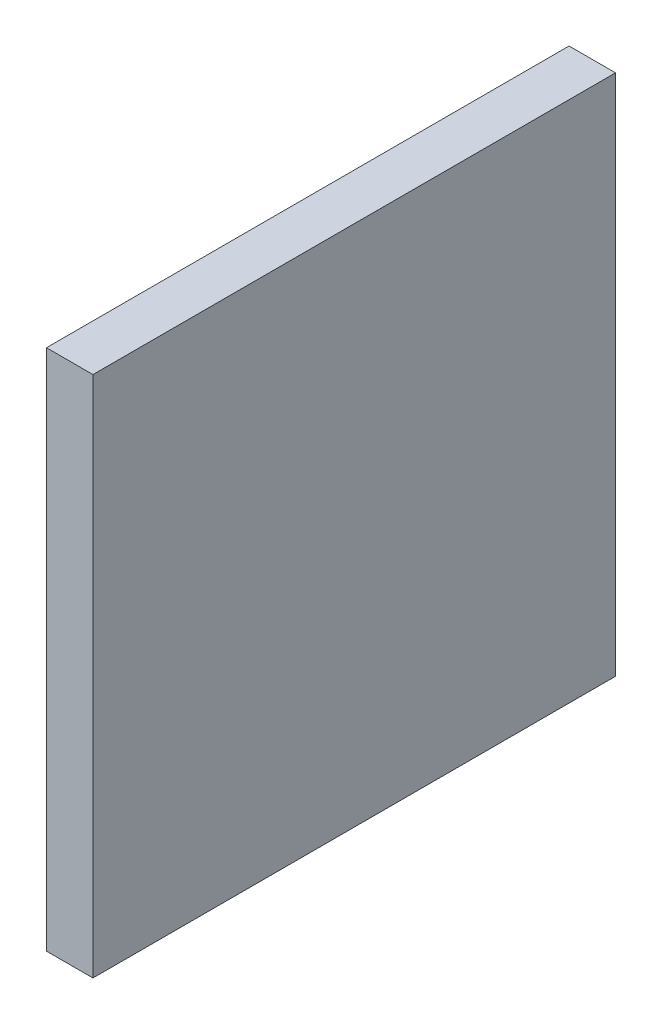
ISO-10303-21;
HEADER;
FILE_DESCRIPTION(('STEP AP214'),'2;1');
FILE_NAME('part.step','',(''),(''),'','','');
FILE_SCHEMA(('AUTOMOTIVE_DESIGN { 1 0 10303 214 1 1 1 1 }'));
ENDSEC;
DATA;
#1=APPLICATION_CONTEXT('core data for automotive mechanical design processes');
#2=APPLICATION_PROTOCOL_DEFINITION('international standard','automotive_design',2000,#1);
#3=PRODUCT_CONTEXT('',#1,'mechanical');
#4=PRODUCT('Part','Part','',(#3));
#5=PRODUCT_RELATED_PRODUCT_CATEGORY('part','',(#4));
#6=PRODUCT_DEFINITION_FORMATION('','',#4);
#7=PRODUCT_DEFINITION_CONTEXT('part definition',#1,'design');
#8=PRODUCT_DEFINITION('design','',#6,#7);
#9=PRODUCT_DEFINITION_SHAPE('','',#8);
#10=(LENGTH_UNIT() NAMED_UNIT(*) SI_UNIT(.MILLI.,.METRE.));
#11=(NAMED_UNIT(*) PLANE_ANGLE_UNIT() SI_UNIT($,.RADIAN.));
#12=(NAMED_UNIT(*) SI_UNIT($,.STERADIAN.) SOLID_ANGLE_UNIT());
#13=UNCERTAINTY_MEASURE_WITH_UNIT(LENGTH_MEASURE(1.E-05),#10,'distance_accuracy_value','');
#14=(GEOMETRIC_REPRESENTATION_CONTEXT(3) GLOBAL_UNCERTAINTY_ASSIGNED_CONTEXT((#13)) GLOBAL_UNIT_ASSIGNED_CONTEXT((#10,
#11,#12)) REPRESENTATION_CONTEXT('',''));
#15=CARTESIAN_POINT('',(0.,0.,0.));
#16=DIRECTION('',(0.,0.,1.));
#17=DIRECTION('',(1.,0.,0.));
#18=AXIS2_PLACEMENT_3D('',#15,#16,#17);
#19=CARTESIAN_POINT('',(-4.98108073090918,-19.7363589291602,0.));
#20=DIRECTION('',(-1.,0.,0.));
#21=DIRECTION('',(0.,-1.,0.));
#22=AXIS2_PLACEMENT_3D('',#19,#20,#21);
#23=PLANE('',#22);
#24=DIRECTION('',(0.,1.,0.));
#25=VECTOR('',#24,1.);
#26=CARTESIAN_POINT('',(-4.98108073090918,15.2636410708398,-28.));
#27=LINE('',#26,#25);
#28=CARTESIAN_POINT('',(-4.98108073090917,-40.7363589291602,-28.));
#29=VERTEX_POINT('',#28);
#30=CARTESIAN_POINT('',(-4.98108073090918,15.2636410708398,-28.));
#31=VERTEX_POINT('',#30);
#32=EDGE_CURVE('E75',#29,#31,#27,.T.);
#33=ORIENTED_EDGE('',*,*,#32,.F.);
#34=DIRECTION('',(0.,0.,-1.));
#35=VECTOR('',#34,1.);
#36=CARTESIAN_POINT('',(-4.98108073090917,-40.7363589291602,28.));
#37=LINE('',#36,#35);
#38=CARTESIAN_POINT('',(-4.98108073090917,-40.7363589291602,28.));
#39=VERTEX_POINT('',#38);
#40=EDGE_CURVE('E83',#39,#29,#37,.T.);
#41=ORIENTED_EDGE('',*,*,#40,.F.);
#42=DIRECTION('',(0.,-1.,0.));
#43=VECTOR('',#42,1.);
#44=CARTESIAN_POINT('',(-4.98108073090918,15.2636410708398,28.));
#45=LINE('',#44,#43);
#46=CARTESIAN_POINT('',(-4.98108073090918,15.2636410708398,28.));
#47=VERTEX_POINT('',#46);
#48=EDGE_CURVE('E49',#47,#39,#45,.T.);
#49=ORIENTED_EDGE('',*,*,#48,.F.);
#50=DIRECTION('',(0.,0.,1.));
#51=VECTOR('',#50,1.);
#52=CARTESIAN_POINT('',(-4.98108073090918,15.2636410708398,28.));
#53=LINE('',#52,#51);
#54=EDGE_CURVE('E73',#31,#47,#53,.T.);
#55=ORIENTED_EDGE('',*,*,#54,.F.);
#56=EDGE_LOOP('',(#33,#41,#49,#55));
#57=FACE_BOUND('',#56,.T.);
#58=ADVANCED_FACE('F33',(#57),#23,.T.);
#59=CARTESIAN_POINT('',(0.,0.,0.));
#60=DIRECTION('',(1.,0.,0.));
#61=DIRECTION('',(0.,0.,-1.));
#62=AXIS2_PLACEMENT_3D('',#59,#60,#61);
#63=PLANE('',#62);
#64=DIRECTION('',(0.,1.,0.));
#65=VECTOR('',#64,1.);
#66=CARTESIAN_POINT('',(0.,15.2636410708398,-28.));
#67=LINE('',#66,#65);
#68=CARTESIAN_POINT('',(0.,-40.7363589291602,-28.));
#69=VERTEX_POINT('',#68);
#70=CARTESIAN_POINT('',(0.,15.2636410708398,-28.));
#71=VERTEX_POINT('',#70);
#72=EDGE_CURVE('E82',#69,#71,#67,.T.);
#73=ORIENTED_EDGE('',*,*,#72,.T.);
#74=DIRECTION('',(0.,0.,1.));
#75=VECTOR('',#74,1.);
#76=CARTESIAN_POINT('',(0.,15.2636410708398,28.));
#77=LINE('',#76,#75);
#78=CARTESIAN_POINT('',(0.,15.2636410708398,28.));
#79=VERTEX_POINT('',#78);
#80=EDGE_CURVE('E87',#71,#79,#77,.T.);
#81=ORIENTED_EDGE('',*,*,#80,.T.);
#82=DIRECTION('',(0.,-1.,0.));
#83=VECTOR('',#82,1.);
#84=CARTESIAN_POINT('',(0.,15.2636410708398,28.));
#85=LINE('',#84,#83);
#86=CARTESIAN_POINT('',(0.,-40.7363589291602,28.));
#87=VERTEX_POINT('',#86);
#88=EDGE_CURVE('E92',#79,#87,#85,.T.);
#89=ORIENTED_EDGE('',*,*,#88,.T.);
#90=DIRECTION('',(0.,0.,-1.));
#91=VECTOR('',#90,1.);
#92=CARTESIAN_POINT('',(0.,-40.7363589291602,28.));
#93=LINE('',#92,#91);
#94=EDGE_CURVE('E90',#87,#69,#93,.T.);
#95=ORIENTED_EDGE('',*,*,#94,.T.);
#96=EDGE_LOOP('',(#73,#81,#89,#95));
#97=FACE_BOUND('',#96,.T.);
#98=ADVANCED_FACE('F103',(#97),#63,.T.);
#99=CARTESIAN_POINT('',(-50.,15.2636410708398,28.));
#100=DIRECTION('',(0.,1.,0.));
#101=DIRECTION('',(0.,0.,1.));
#102=AXIS2_PLACEMENT_3D('',#99,#100,#101);
#103=PLANE('',#102);
#104=DIRECTION('',(1.,0.,0.));
#105=VECTOR('',#104,1.);
#106=CARTESIAN_POINT('',(-50.,15.2636410708398,-28.));
#107=LINE('',#106,#105);
#108=EDGE_CURVE('E36',#31,#71,#107,.T.);
#109=ORIENTED_EDGE('',*,*,#108,.F.);
#110=ORIENTED_EDGE('',*,*,#54,.T.);
#111=DIRECTION('',(1.,0.,0.));
#112=VECTOR('',#111,1.);
#113=CARTESIAN_POINT('',(-50.,15.2636410708398,28.));
#114=LINE('',#113,#112);
#115=EDGE_CURVE('E89',#47,#79,#114,.T.);
#116=ORIENTED_EDGE('',*,*,#115,.T.);
#117=ORIENTED_EDGE('',*,*,#80,.F.);
#118=EDGE_LOOP('',(#109,#110,#116,#117));
#119=FACE_BOUND('',#118,.T.);
#120=ADVANCED_FACE('F85',(#119),#103,.T.);
#121=CARTESIAN_POINT('',(-50.,15.2636410708398,28.));
#122=DIRECTION('',(0.,0.,1.));
#123=DIRECTION('',(0.,-1.,0.));
#124=AXIS2_PLACEMENT_3D('',#121,#122,#123);
#125=PLANE('',#124);
#126=ORIENTED_EDGE('',*,*,#115,.F.);
#127=ORIENTED_EDGE('',*,*,#48,.T.);
#128=DIRECTION('',(1.,0.,0.));
#129=VECTOR('',#128,1.);
#130=CARTESIAN_POINT('',(-50.,-40.7363589291602,28.));
#131=LINE('',#130,#129);
#132=EDGE_CURVE('E41',#39,#87,#131,.T.);
#133=ORIENTED_EDGE('',*,*,#132,.T.);
#134=ORIENTED_EDGE('',*,*,#88,.F.);
#135=EDGE_LOOP('',(#126,#127,#133,#134));
#136=FACE_BOUND('',#135,.T.);
#137=ADVANCED_FACE('F102',(#136),#125,.T.);
#138=CARTESIAN_POINT('',(-50.,-40.7363589291602,28.));
#139=DIRECTION('',(0.,-1.,0.));
#140=DIRECTION('',(0.,0.,-1.));
#141=AXIS2_PLACEMENT_3D('',#138,#139,#140);
#142=PLANE('',#141);
#143=ORIENTED_EDGE('',*,*,#132,.F.);
#144=ORIENTED_EDGE('',*,*,#40,.T.);
#145=DIRECTION('',(1.,0.,0.));
#146=VECTOR('',#145,1.);
#147=CARTESIAN_POINT('',(-50.,-40.7363589291602,-28.));
#148=LINE('',#147,#146);
#149=EDGE_CURVE('E11',#29,#69,#148,.T.);
#150=ORIENTED_EDGE('',*,*,#149,.T.);
#151=ORIENTED_EDGE('',*,*,#94,.F.);
#152=EDGE_LOOP('',(#143,#144,#150,#151));
#153=FACE_BOUND('',#152,.T.);
#154=ADVANCED_FACE('F104',(#153),#142,.T.);
#155=CARTESIAN_POINT('',(-50.,15.2636410708398,-28.));
#156=DIRECTION('',(0.,0.,-1.));
#157=DIRECTION('',(0.,1.,0.));
#158=AXIS2_PLACEMENT_3D('',#155,#156,#157);
#159=PLANE('',#158);
#160=ORIENTED_EDGE('',*,*,#149,.F.);
#161=ORIENTED_EDGE('',*,*,#32,.T.);
#162=ORIENTED_EDGE('',*,*,#108,.T.);
#163=ORIENTED_EDGE('',*,*,#72,.F.);
#164=EDGE_LOOP('',(#160,#161,#162,#163));
#165=FACE_BOUND('',#164,.T.);
#166=ADVANCED_FACE('F80',(#165),#159,.T.);
#167=CLOSED_SHELL('',(#58,#98,#120,#137,#154,#166));
#168=MANIFOLD_SOLID_BREP('B2',#167);
#169=ADVANCED_BREP_SHAPE_REPRESENTATION('',(#18,#168),#14);
#170=SHAPE_DEFINITION_REPRESENTATION(#9,#169);
ENDSEC;
END-ISO-10303-21;
